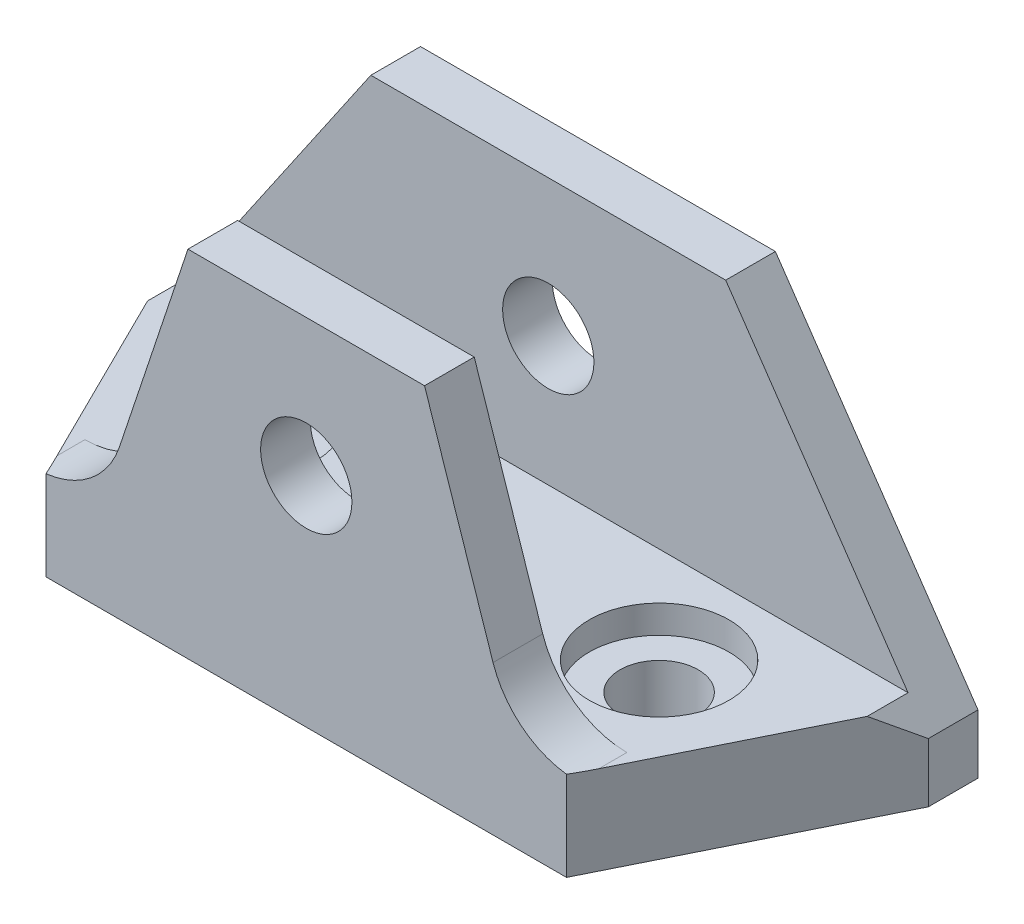
ISO-10303-21;
HEADER;
FILE_DESCRIPTION(('STEP AP214'),'2;1');
FILE_NAME('part.step','',(''),(''),'','','');
FILE_SCHEMA(('AUTOMOTIVE_DESIGN { 1 0 10303 214 1 1 1 1 }'));
ENDSEC;
DATA;
#1=APPLICATION_CONTEXT('core data for automotive mechanical design processes');
#2=APPLICATION_PROTOCOL_DEFINITION('international standard','automotive_design',2000,#1);
#3=PRODUCT_CONTEXT('',#1,'mechanical');
#4=PRODUCT('Part','Part','',(#3));
#5=PRODUCT_RELATED_PRODUCT_CATEGORY('part','',(#4));
#6=PRODUCT_DEFINITION_FORMATION('','',#4);
#7=PRODUCT_DEFINITION_CONTEXT('part definition',#1,'design');
#8=PRODUCT_DEFINITION('design','',#6,#7);
#9=PRODUCT_DEFINITION_SHAPE('','',#8);
#10=(LENGTH_UNIT() NAMED_UNIT(*) SI_UNIT(.MILLI.,.METRE.));
#11=(NAMED_UNIT(*) PLANE_ANGLE_UNIT() SI_UNIT($,.RADIAN.));
#12=(NAMED_UNIT(*) SI_UNIT($,.STERADIAN.) SOLID_ANGLE_UNIT());
#13=UNCERTAINTY_MEASURE_WITH_UNIT(LENGTH_MEASURE(1.E-05),#10,'distance_accuracy_value','');
#14=(GEOMETRIC_REPRESENTATION_CONTEXT(3) GLOBAL_UNCERTAINTY_ASSIGNED_CONTEXT((#13)) GLOBAL_UNIT_ASSIGNED_CONTEXT((#10,
#11,#12)) REPRESENTATION_CONTEXT('',''));
#15=CARTESIAN_POINT('',(0.,0.,0.));
#16=DIRECTION('',(0.,0.,1.));
#17=DIRECTION('',(1.,0.,0.));
#18=AXIS2_PLACEMENT_3D('',#15,#16,#17);
#19=CARTESIAN_POINT('',(0.,38.1,0.));
#20=DIRECTION('',(0.,1.,0.));
#21=DIRECTION('',(0.,0.,1.));
#22=AXIS2_PLACEMENT_3D('',#19,#20,#21);
#23=PLANE('',#22);
#24=DIRECTION('',(1.,0.,0.));
#25=VECTOR('',#24,1.);
#26=CARTESIAN_POINT('',(-78.9580948623392,38.0999999999999,15.6591));
#27=LINE('',#26,#25);
#28=CARTESIAN_POINT('',(-12.7,38.1,15.6591));
#29=VERTEX_POINT('',#28);
#30=CARTESIAN_POINT('',(12.7,38.1,15.6591));
#31=VERTEX_POINT('',#30);
#32=EDGE_CURVE('E270',#29,#31,#27,.T.);
#33=ORIENTED_EDGE('',*,*,#32,.T.);
#34=DIRECTION('',(0.,0.,-1.));
#35=VECTOR('',#34,1.);
#36=CARTESIAN_POINT('',(12.7,38.1,17.6921));
#37=LINE('',#36,#35);
#38=CARTESIAN_POINT('',(12.7,38.1,10.3251));
#39=VERTEX_POINT('',#38);
#40=EDGE_CURVE('E201',#31,#39,#37,.T.);
#41=ORIENTED_EDGE('',*,*,#40,.T.);
#42=DIRECTION('',(1.,0.,0.));
#43=VECTOR('',#42,1.);
#44=CARTESIAN_POINT('',(0.,38.1,10.3251));
#45=LINE('',#44,#43);
#46=CARTESIAN_POINT('',(-12.7,38.1,10.3251));
#47=VERTEX_POINT('',#46);
#48=EDGE_CURVE('E246',#47,#39,#45,.T.);
#49=ORIENTED_EDGE('',*,*,#48,.F.);
#50=DIRECTION('',(0.,0.,-1.));
#51=VECTOR('',#50,1.);
#52=CARTESIAN_POINT('',(-12.7,38.1,17.6921));
#53=LINE('',#52,#51);
#54=EDGE_CURVE('E200',#29,#47,#53,.T.);
#55=ORIENTED_EDGE('',*,*,#54,.F.);
#56=EDGE_LOOP('',(#33,#41,#49,#55));
#57=FACE_BOUND('',#56,.T.);
#58=ADVANCED_FACE('F46',(#57),#23,.T.);
#59=CARTESIAN_POINT('',(-26.9363714361226,38.1,17.6911));
#60=DIRECTION('',(0.896218075688714,0.,-0.443613751825637));
#61=DIRECTION('',(-0.443613751825637,0.,-0.896218075688714));
#62=AXIS2_PLACEMENT_3D('',#59,#60,#61);
#63=PLANE('',#62);
#64=DIRECTION('',(0.443613751825637,0.,0.896218075688714));
#65=VECTOR('',#64,1.);
#66=CARTESIAN_POINT('',(-26.9363714361226,0.,17.6911));
#67=LINE('',#66,#65);
#68=CARTESIAN_POINT('',(-40.8039466737082,0.,-10.3251));
#69=VERTEX_POINT('',#68);
#70=CARTESIAN_POINT('',(-27.9421792502721,-1.19709658412708E-13,15.6591));
#71=VERTEX_POINT('',#70);
#72=EDGE_CURVE('E184',#69,#71,#67,.T.);
#73=ORIENTED_EDGE('',*,*,#72,.T.);
#74=DIRECTION('',(0.,1.,0.));
#75=VECTOR('',#74,1.);
#76=CARTESIAN_POINT('',(-27.9421792502721,38.1,15.6591));
#77=LINE('',#76,#75);
#78=CARTESIAN_POINT('',(-27.9421792502721,9.59444074267461,15.6591));
#79=VERTEX_POINT('',#78);
#80=EDGE_CURVE('E294',#71,#79,#77,.T.);
#81=ORIENTED_EDGE('',*,*,#80,.T.);
#82=CARTESIAN_POINT('',(-29.0902315710346,19.05,13.3397281647731));
#83=DIRECTION('',(0.896218075688714,0.,-0.443613751825637));
#84=DIRECTION('',(-0.443613751825637,0.,-0.896218075688714));
#85=AXIS2_PLACEMENT_3D('',#82,#83,#84);
#86=ELLIPSE('',#85,21.4713812653486,9.525);
#87=CARTESIAN_POINT('',(-29.0902315710346,9.525,13.3397281647731));
#88=VERTEX_POINT('',#87);
#89=EDGE_CURVE('E264',#79,#88,#86,.T.);
#90=ORIENTED_EDGE('',*,*,#89,.T.);
#91=DIRECTION('',(0.443613751825637,0.,0.896218075688714));
#92=VECTOR('',#91,1.);
#93=CARTESIAN_POINT('',(-26.9363714361226,9.525,17.6911));
#94=LINE('',#93,#92);
#95=CARTESIAN_POINT('',(-38.6285520063374,9.525,-5.93022266666416));
#96=VERTEX_POINT('',#95);
#97=EDGE_CURVE('E237',#96,#88,#94,.T.);
#98=ORIENTED_EDGE('',*,*,#97,.F.);
#99=DIRECTION('',(0.372377292082729,0.543486623414217,0.752301430618703));
#100=VECTOR('',#99,1.);
#101=CARTESIAN_POINT('',(-28.5822622587059,24.1876129167084,14.3659616341608));
#102=LINE('',#101,#100);
#103=CARTESIAN_POINT('',(-40.8039466737082,6.35,-10.3251));
#104=VERTEX_POINT('',#103);
#105=EDGE_CURVE('E325',#104,#96,#102,.T.);
#106=ORIENTED_EDGE('',*,*,#105,.F.);
#107=DIRECTION('',(0.,1.,0.));
#108=VECTOR('',#107,1.);
#109=CARTESIAN_POINT('',(-40.8039466737082,0.,-10.3251));
#110=LINE('',#109,#108);
#111=EDGE_CURVE('E307',#69,#104,#110,.T.);
#112=ORIENTED_EDGE('',*,*,#111,.F.);
#113=EDGE_LOOP('',(#73,#81,#90,#98,#106,#112));
#114=FACE_BOUND('',#113,.T.);
#115=ADVANCED_FACE('F369',(#114),#63,.F.);
#116=CARTESIAN_POINT('',(44.45,38.1,-17.6911));
#117=DIRECTION('',(-0.896218075688714,0.,-0.443613751825637));
#118=DIRECTION('',(-0.443613751825637,0.,0.896218075688714));
#119=AXIS2_PLACEMENT_3D('',#116,#117,#118);
#120=PLANE('',#119);
#121=CARTESIAN_POINT('',(29.0902315710346,19.05,13.3397281647731));
#122=DIRECTION('',(-0.896218075688714,0.,-0.443613751825637));
#123=DIRECTION('',(0.443613751825637,0.,-0.896218075688714));
#124=AXIS2_PLACEMENT_3D('',#121,#122,#123);
#125=ELLIPSE('',#124,21.4713812653486,9.525);
#126=CARTESIAN_POINT('',(29.0902315710346,9.525,13.3397281647731));
#127=VERTEX_POINT('',#126);
#128=CARTESIAN_POINT('',(27.9421792502721,9.59444074267461,15.6591));
#129=VERTEX_POINT('',#128);
#130=EDGE_CURVE('E12',#127,#129,#125,.T.);
#131=ORIENTED_EDGE('',*,*,#130,.T.);
#132=DIRECTION('',(0.,-1.,0.));
#133=VECTOR('',#132,1.);
#134=CARTESIAN_POINT('',(27.9421792502721,38.1,15.6591));
#135=LINE('',#134,#133);
#136=CARTESIAN_POINT('',(27.9421792502721,0.,15.6591));
#137=VERTEX_POINT('',#136);
#138=EDGE_CURVE('E63',#129,#137,#135,.T.);
#139=ORIENTED_EDGE('',*,*,#138,.T.);
#140=DIRECTION('',(0.443613751825637,0.,-0.896218075688714));
#141=VECTOR('',#140,1.);
#142=CARTESIAN_POINT('',(44.45,0.,-17.6911));
#143=LINE('',#142,#141);
#144=CARTESIAN_POINT('',(40.8039466737082,0.,-10.3251));
#145=VERTEX_POINT('',#144);
#146=EDGE_CURVE('E241',#137,#145,#143,.T.);
#147=ORIENTED_EDGE('',*,*,#146,.T.);
#148=DIRECTION('',(0.,-1.,0.));
#149=VECTOR('',#148,1.);
#150=CARTESIAN_POINT('',(40.8039466737082,-1.064395312124E-13,-10.3251));
#151=LINE('',#150,#149);
#152=CARTESIAN_POINT('',(40.8039466737082,6.35,-10.3251));
#153=VERTEX_POINT('',#152);
#154=EDGE_CURVE('E309',#153,#145,#151,.T.);
#155=ORIENTED_EDGE('',*,*,#154,.F.);
#156=DIRECTION('',(0.372377292082728,-0.543486623414217,-0.752301430618703));
#157=VECTOR('',#156,1.);
#158=CARTESIAN_POINT('',(28.582262258706,24.1876129167083,14.3659616341608));
#159=LINE('',#158,#157);
#160=CARTESIAN_POINT('',(38.6285520063374,9.525,-5.93022266666406));
#161=VERTEX_POINT('',#160);
#162=EDGE_CURVE('E196',#161,#153,#159,.T.);
#163=ORIENTED_EDGE('',*,*,#162,.F.);
#164=DIRECTION('',(0.443613751825637,0.,-0.896218075688714));
#165=VECTOR('',#164,1.);
#166=CARTESIAN_POINT('',(44.45,9.525,-17.6911));
#167=LINE('',#166,#165);
#168=EDGE_CURVE('E249',#127,#161,#167,.T.);
#169=ORIENTED_EDGE('',*,*,#168,.F.);
#170=EDGE_LOOP('',(#131,#139,#147,#155,#163,#169));
#171=FACE_BOUND('',#170,.T.);
#172=ADVANCED_FACE('F347',(#171),#120,.F.);
#173=DIRECTION('',(1.,0.,0.));
#174=VECTOR('',#173,1.);
#175=CARTESIAN_POINT('',(-78.9580948623392,38.0999999999999,-15.6591));
#176=LINE('',#175,#174);
#177=CARTESIAN_POINT('',(-19.05,38.1,-15.6591));
#178=VERTEX_POINT('',#177);
#179=CARTESIAN_POINT('',(19.05,38.1,-15.6591));
#180=VERTEX_POINT('',#179);
#181=EDGE_CURVE('E71',#178,#180,#176,.T.);
#182=ORIENTED_EDGE('',*,*,#181,.F.);
#183=DIRECTION('',(0.,0.,-1.));
#184=VECTOR('',#183,1.);
#185=CARTESIAN_POINT('',(-19.05,38.1,17.6921));
#186=LINE('',#185,#184);
#187=CARTESIAN_POINT('',(-19.05,38.1,-10.3251));
#188=VERTEX_POINT('',#187);
#189=EDGE_CURVE('E185',#188,#178,#186,.T.);
#190=ORIENTED_EDGE('',*,*,#189,.F.);
#191=DIRECTION('',(-1.,0.,0.));
#192=VECTOR('',#191,1.);
#193=CARTESIAN_POINT('',(0.,38.1,-10.3251));
#194=LINE('',#193,#192);
#195=CARTESIAN_POINT('',(19.05,38.1,-10.3251));
#196=VERTEX_POINT('',#195);
#197=EDGE_CURVE('E243',#196,#188,#194,.T.);
#198=ORIENTED_EDGE('',*,*,#197,.F.);
#199=DIRECTION('',(0.,0.,-1.));
#200=VECTOR('',#199,1.);
#201=CARTESIAN_POINT('',(19.05,38.1,17.6921));
#202=LINE('',#201,#200);
#203=EDGE_CURVE('E316',#196,#180,#202,.T.);
#204=ORIENTED_EDGE('',*,*,#203,.T.);
#205=EDGE_LOOP('',(#182,#190,#198,#204));
#206=FACE_BOUND('',#205,.T.);
#207=ADVANCED_FACE('F334',(#206),#23,.T.);
#208=CARTESIAN_POINT('',(0.,0.,0.));
#209=DIRECTION('',(0.,1.,0.));
#210=DIRECTION('',(0.,0.,1.));
#211=AXIS2_PLACEMENT_3D('',#208,#209,#210);
#212=PLANE('',#211);
#213=CARTESIAN_POINT('',(-22.225,0.,0.));
#214=DIRECTION('',(0.,1.,0.));
#215=DIRECTION('',(0.,0.,1.));
#216=AXIS2_PLACEMENT_3D('',#213,#214,#215);
#217=CIRCLE('',#216,4.2);
#218=CARTESIAN_POINT('',(-22.225,0.,4.2));
#219=VERTEX_POINT('',#218);
#220=EDGE_CURVE('E217',#219,#219,#217,.T.);
#221=ORIENTED_EDGE('',*,*,#220,.T.);
#222=EDGE_LOOP('',(#221));
#223=FACE_BOUND('',#222,.T.);
#224=CARTESIAN_POINT('',(22.225,0.,0.));
#225=DIRECTION('',(0.,1.,0.));
#226=DIRECTION('',(0.,0.,1.));
#227=AXIS2_PLACEMENT_3D('',#224,#225,#226);
#228=CIRCLE('',#227,4.2);
#229=CARTESIAN_POINT('',(22.225,0.,4.2));
#230=VERTEX_POINT('',#229);
#231=EDGE_CURVE('E229',#230,#230,#228,.T.);
#232=ORIENTED_EDGE('',*,*,#231,.T.);
#233=EDGE_LOOP('',(#232));
#234=FACE_BOUND('',#233,.T.);
#235=ORIENTED_EDGE('',*,*,#146,.F.);
#236=DIRECTION('',(1.,0.,0.));
#237=VECTOR('',#236,1.);
#238=CARTESIAN_POINT('',(-78.9580948623392,-1.75456749096616E-13,15.6591));
#239=LINE('',#238,#237);
#240=EDGE_CURVE('E276',#71,#137,#239,.T.);
#241=ORIENTED_EDGE('',*,*,#240,.F.);
#242=ORIENTED_EDGE('',*,*,#72,.F.);
#243=DIRECTION('',(0.,0.,-1.));
#244=VECTOR('',#243,1.);
#245=CARTESIAN_POINT('',(-40.8039466737082,0.,17.6921));
#246=LINE('',#245,#244);
#247=CARTESIAN_POINT('',(-40.8039466737082,-1.75705597326203E-13,-15.6591));
#248=VERTEX_POINT('',#247);
#249=EDGE_CURVE('E174',#69,#248,#246,.T.);
#250=ORIENTED_EDGE('',*,*,#249,.T.);
#251=DIRECTION('',(1.,0.,0.));
#252=VECTOR('',#251,1.);
#253=CARTESIAN_POINT('',(-78.9580948623392,-1.75705597326203E-13,-15.6591));
#254=LINE('',#253,#252);
#255=CARTESIAN_POINT('',(40.8039466737082,0.,-15.6591));
#256=VERTEX_POINT('',#255);
#257=EDGE_CURVE('E159',#248,#256,#254,.T.);
#258=ORIENTED_EDGE('',*,*,#257,.T.);
#259=DIRECTION('',(0.,0.,-1.));
#260=VECTOR('',#259,1.);
#261=CARTESIAN_POINT('',(40.8039466737082,0.,17.6921));
#262=LINE('',#261,#260);
#263=EDGE_CURVE('E313',#145,#256,#262,.T.);
#264=ORIENTED_EDGE('',*,*,#263,.F.);
#265=EDGE_LOOP('',(#235,#241,#242,#250,#258,#264));
#266=FACE_BOUND('',#265,.T.);
#267=ADVANCED_FACE('F181',(#223,#234,#266),#212,.F.);
#268=CARTESIAN_POINT('',(0.,9.525,0.));
#269=DIRECTION('',(0.,1.,0.));
#270=DIRECTION('',(0.,0.,1.));
#271=AXIS2_PLACEMENT_3D('',#268,#269,#270);
#272=PLANE('',#271);
#273=DIRECTION('',(0.,0.,-1.));
#274=VECTOR('',#273,1.);
#275=CARTESIAN_POINT('',(38.6285520063374,9.525,17.6921));
#276=LINE('',#275,#274);
#277=CARTESIAN_POINT('',(38.6285520063374,9.52500000000001,-10.3251));
#278=VERTEX_POINT('',#277);
#279=EDGE_CURVE('E207',#161,#278,#276,.T.);
#280=ORIENTED_EDGE('',*,*,#279,.T.);
#281=DIRECTION('',(1.,0.,0.));
#282=VECTOR('',#281,1.);
#283=CARTESIAN_POINT('',(-44.45,9.52500000000001,-10.3251));
#284=LINE('',#283,#282);
#285=CARTESIAN_POINT('',(-38.6285520063374,9.52500000000001,-10.3251));
#286=VERTEX_POINT('',#285);
#287=EDGE_CURVE('E234',#286,#278,#284,.T.);
#288=ORIENTED_EDGE('',*,*,#287,.F.);
#289=DIRECTION('',(0.,0.,1.));
#290=VECTOR('',#289,1.);
#291=CARTESIAN_POINT('',(-38.6285520063374,9.525,17.6921));
#292=LINE('',#291,#290);
#293=EDGE_CURVE('E188',#286,#96,#292,.T.);
#294=ORIENTED_EDGE('',*,*,#293,.T.);
#295=ORIENTED_EDGE('',*,*,#97,.T.);
#296=DIRECTION('',(0.,0.,-1.));
#297=VECTOR('',#296,1.);
#298=CARTESIAN_POINT('',(-29.0902315710346,9.525,0.));
#299=LINE('',#298,#297);
#300=CARTESIAN_POINT('',(-29.0902315710346,9.52500000000001,10.3251));
#301=VERTEX_POINT('',#300);
#302=EDGE_CURVE('E254',#88,#301,#299,.T.);
#303=ORIENTED_EDGE('',*,*,#302,.T.);
#304=DIRECTION('',(-1.,0.,0.));
#305=VECTOR('',#304,1.);
#306=CARTESIAN_POINT('',(-44.45,9.52500000000001,10.3251));
#307=LINE('',#306,#305);
#308=CARTESIAN_POINT('',(29.0902315710346,9.525,10.3251));
#309=VERTEX_POINT('',#308);
#310=EDGE_CURVE('E232',#309,#301,#307,.T.);
#311=ORIENTED_EDGE('',*,*,#310,.F.);
#312=DIRECTION('',(0.,0.,-1.));
#313=VECTOR('',#312,1.);
#314=CARTESIAN_POINT('',(29.0902315710346,9.525,0.));
#315=LINE('',#314,#313);
#316=EDGE_CURVE('E252',#309,#127,#315,.F.);
#317=ORIENTED_EDGE('',*,*,#316,.T.);
#318=ORIENTED_EDGE('',*,*,#168,.T.);
#319=EDGE_LOOP('',(#280,#288,#294,#295,#303,#311,#317,#318));
#320=FACE_BOUND('',#319,.T.);
#321=CARTESIAN_POINT('',(-22.225,9.525,0.));
#322=DIRECTION('',(0.,1.,0.));
#323=DIRECTION('',(0.,0.,1.));
#324=AXIS2_PLACEMENT_3D('',#321,#322,#323);
#325=CIRCLE('',#324,7.5);
#326=CARTESIAN_POINT('',(-22.225,9.525,7.5));
#327=VERTEX_POINT('',#326);
#328=EDGE_CURVE('E203',#327,#327,#325,.T.);
#329=ORIENTED_EDGE('',*,*,#328,.F.);
#330=EDGE_LOOP('',(#329));
#331=FACE_BOUND('',#330,.T.);
#332=CARTESIAN_POINT('',(22.225,9.525,0.));
#333=DIRECTION('',(0.,1.,0.));
#334=DIRECTION('',(0.,0.,1.));
#335=AXIS2_PLACEMENT_3D('',#332,#333,#334);
#336=CIRCLE('',#335,7.5);
#337=CARTESIAN_POINT('',(22.225,9.525,7.5));
#338=VERTEX_POINT('',#337);
#339=EDGE_CURVE('E220',#338,#338,#336,.T.);
#340=ORIENTED_EDGE('',*,*,#339,.F.);
#341=EDGE_LOOP('',(#340));
#342=FACE_BOUND('',#341,.T.);
#343=ADVANCED_FACE('F341',(#320,#331,#342),#272,.T.);
#344=CARTESIAN_POINT('',(-44.45,-91.266865619676,10.3251));
#345=DIRECTION('',(0.,0.,1.));
#346=DIRECTION('',(1.,0.,0.));
#347=AXIS2_PLACEMENT_3D('',#344,#345,#346);
#348=PLANE('',#347);
#349=CARTESIAN_POINT('',(0.,23.392384,10.3251));
#350=DIRECTION('',(0.,0.,1.));
#351=DIRECTION('',(1.,0.,0.));
#352=AXIS2_PLACEMENT_3D('',#349,#350,#351);
#353=CIRCLE('',#352,4.90219999999999);
#354=CARTESIAN_POINT('',(4.90219999999999,23.392384,10.3251));
#355=VERTEX_POINT('',#354);
#356=EDGE_CURVE('E304',#355,#355,#353,.T.);
#357=ORIENTED_EDGE('',*,*,#356,.T.);
#358=EDGE_LOOP('',(#357));
#359=FACE_BOUND('',#358,.T.);
#360=ORIENTED_EDGE('',*,*,#310,.T.);
#361=CARTESIAN_POINT('',(-29.0902315710346,19.05,10.3251));
#362=DIRECTION('',(0.,0.,1.));
#363=DIRECTION('',(1.,0.,0.));
#364=AXIS2_PLACEMENT_3D('',#361,#362,#363);
#365=CIRCLE('',#364,9.525);
#366=CARTESIAN_POINT('',(-20.0540231571035,16.0379305286896,10.3251));
#367=VERTEX_POINT('',#366);
#368=EDGE_CURVE('E262',#301,#367,#365,.T.);
#369=ORIENTED_EDGE('',*,*,#368,.T.);
#370=DIRECTION('',(-0.316227766016838,-0.948683298050514,0.));
#371=VECTOR('',#370,1.);
#372=CARTESIAN_POINT('',(-22.86,7.62000000000001,10.3251));
#373=LINE('',#372,#371);
#374=EDGE_CURVE('E197',#47,#367,#373,.T.);
#375=ORIENTED_EDGE('',*,*,#374,.F.);
#376=ORIENTED_EDGE('',*,*,#48,.T.);
#377=DIRECTION('',(-0.316227766016838,0.948683298050514,0.));
#378=VECTOR('',#377,1.);
#379=CARTESIAN_POINT('',(22.86,7.61999999999999,10.3251));
#380=LINE('',#379,#378);
#381=CARTESIAN_POINT('',(20.0540231571035,16.0379305286896,10.3251));
#382=VERTEX_POINT('',#381);
#383=EDGE_CURVE('E204',#382,#39,#380,.T.);
#384=ORIENTED_EDGE('',*,*,#383,.F.);
#385=CARTESIAN_POINT('',(29.0902315710346,19.05,10.3251));
#386=DIRECTION('',(0.,0.,1.));
#387=DIRECTION('',(1.,0.,0.));
#388=AXIS2_PLACEMENT_3D('',#385,#386,#387);
#389=CIRCLE('',#388,9.525);
#390=EDGE_CURVE('E55',#382,#309,#389,.T.);
#391=ORIENTED_EDGE('',*,*,#390,.T.);
#392=EDGE_LOOP('',(#360,#369,#375,#376,#384,#391));
#393=FACE_BOUND('',#392,.T.);
#394=ADVANCED_FACE('F359',(#359,#393),#348,.F.);
#395=CARTESIAN_POINT('',(-44.45,-91.266865619676,-10.3251));
#396=DIRECTION('',(0.,0.,-1.));
#397=DIRECTION('',(-1.,0.,0.));
#398=AXIS2_PLACEMENT_3D('',#395,#396,#397);
#399=PLANE('',#398);
#400=CARTESIAN_POINT('',(0.,23.392384,-10.3251));
#401=DIRECTION('',(0.,0.,-1.));
#402=DIRECTION('',(-1.,0.,0.));
#403=AXIS2_PLACEMENT_3D('',#400,#401,#402);
#404=CIRCLE('',#403,4.90219999999999);
#405=CARTESIAN_POINT('',(-4.90219999999999,23.392384,-10.3251));
#406=VERTEX_POINT('',#405);
#407=EDGE_CURVE('E301',#406,#406,#404,.T.);
#408=ORIENTED_EDGE('',*,*,#407,.T.);
#409=EDGE_LOOP('',(#408));
#410=FACE_BOUND('',#409,.T.);
#411=ORIENTED_EDGE('',*,*,#287,.T.);
#412=DIRECTION('',(0.565219364643958,-0.824940646247644,0.));
#413=VECTOR('',#412,1.);
#414=CARTESIAN_POINT('',(30.7290201848444,21.054408391698,-10.3251));
#415=LINE('',#414,#413);
#416=EDGE_CURVE('E315',#196,#278,#415,.T.);
#417=ORIENTED_EDGE('',*,*,#416,.F.);
#418=ORIENTED_EDGE('',*,*,#197,.T.);
#419=DIRECTION('',(0.565219364643958,0.824940646247644,0.));
#420=VECTOR('',#419,1.);
#421=CARTESIAN_POINT('',(-30.7290201848444,21.054408391698,-10.3251));
#422=LINE('',#421,#420);
#423=EDGE_CURVE('E190',#286,#188,#422,.T.);
#424=ORIENTED_EDGE('',*,*,#423,.F.);
#425=EDGE_LOOP('',(#411,#417,#418,#424));
#426=FACE_BOUND('',#425,.T.);
#427=ADVANCED_FACE('F336',(#410,#426),#399,.F.);
#428=CARTESIAN_POINT('',(22.225,9.525,0.));
#429=DIRECTION('',(0.,1.,0.));
#430=DIRECTION('',(0.,0.,1.));
#431=AXIS2_PLACEMENT_3D('',#428,#429,#430);
#432=CYLINDRICAL_SURFACE('',#431,4.2);
#433=ORIENTED_EDGE('',*,*,#231,.F.);
#434=EDGE_LOOP('',(#433));
#435=FACE_BOUND('',#434,.T.);
#436=CARTESIAN_POINT('',(22.225,6.525,0.));
#437=DIRECTION('',(0.,1.,0.));
#438=DIRECTION('',(0.,0.,1.));
#439=AXIS2_PLACEMENT_3D('',#436,#437,#438);
#440=CIRCLE('',#439,4.2);
#441=CARTESIAN_POINT('',(22.225,6.525,4.2));
#442=VERTEX_POINT('',#441);
#443=EDGE_CURVE('E226',#442,#442,#440,.T.);
#444=ORIENTED_EDGE('',*,*,#443,.T.);
#445=EDGE_LOOP('',(#444));
#446=FACE_BOUND('',#445,.T.);
#447=ADVANCED_FACE('F413',(#435,#446),#432,.F.);
#448=CARTESIAN_POINT('',(26.425,6.525,0.));
#449=DIRECTION('',(0.,-1.,0.));
#450=DIRECTION('',(0.,0.,-1.));
#451=AXIS2_PLACEMENT_3D('',#448,#449,#450);
#452=PLANE('',#451);
#453=ORIENTED_EDGE('',*,*,#443,.F.);
#454=EDGE_LOOP('',(#453));
#455=FACE_BOUND('',#454,.T.);
#456=CARTESIAN_POINT('',(22.225,6.525,0.));
#457=DIRECTION('',(0.,1.,0.));
#458=DIRECTION('',(0.,0.,1.));
#459=AXIS2_PLACEMENT_3D('',#456,#457,#458);
#460=CIRCLE('',#459,7.5);
#461=CARTESIAN_POINT('',(22.225,6.525,7.5));
#462=VERTEX_POINT('',#461);
#463=EDGE_CURVE('E223',#462,#462,#460,.T.);
#464=ORIENTED_EDGE('',*,*,#463,.T.);
#465=EDGE_LOOP('',(#464));
#466=FACE_BOUND('',#465,.T.);
#467=ADVANCED_FACE('F409',(#455,#466),#452,.F.);
#468=CARTESIAN_POINT('',(22.225,9.525,0.));
#469=DIRECTION('',(0.,1.,0.));
#470=DIRECTION('',(0.,0.,1.));
#471=AXIS2_PLACEMENT_3D('',#468,#469,#470);
#472=CYLINDRICAL_SURFACE('',#471,7.5);
#473=ORIENTED_EDGE('',*,*,#463,.F.);
#474=EDGE_LOOP('',(#473));
#475=FACE_BOUND('',#474,.T.);
#476=ORIENTED_EDGE('',*,*,#339,.T.);
#477=EDGE_LOOP('',(#476));
#478=FACE_BOUND('',#477,.T.);
#479=ADVANCED_FACE('F405',(#475,#478),#472,.F.);
#480=CARTESIAN_POINT('',(-22.225,9.525,0.));
#481=DIRECTION('',(0.,1.,0.));
#482=DIRECTION('',(0.,0.,1.));
#483=AXIS2_PLACEMENT_3D('',#480,#481,#482);
#484=CYLINDRICAL_SURFACE('',#483,4.2);
#485=ORIENTED_EDGE('',*,*,#220,.F.);
#486=EDGE_LOOP('',(#485));
#487=FACE_BOUND('',#486,.T.);
#488=CARTESIAN_POINT('',(-22.225,6.525,0.));
#489=DIRECTION('',(0.,1.,0.));
#490=DIRECTION('',(0.,0.,1.));
#491=AXIS2_PLACEMENT_3D('',#488,#489,#490);
#492=CIRCLE('',#491,4.2);
#493=CARTESIAN_POINT('',(-22.225,6.525,4.2));
#494=VERTEX_POINT('',#493);
#495=EDGE_CURVE('E214',#494,#494,#492,.T.);
#496=ORIENTED_EDGE('',*,*,#495,.T.);
#497=EDGE_LOOP('',(#496));
#498=FACE_BOUND('',#497,.T.);
#499=ADVANCED_FACE('F401',(#487,#498),#484,.F.);
#500=CARTESIAN_POINT('',(-18.025,6.525,0.));
#501=DIRECTION('',(0.,-1.,0.));
#502=DIRECTION('',(0.,0.,-1.));
#503=AXIS2_PLACEMENT_3D('',#500,#501,#502);
#504=PLANE('',#503);
#505=ORIENTED_EDGE('',*,*,#495,.F.);
#506=EDGE_LOOP('',(#505));
#507=FACE_BOUND('',#506,.T.);
#508=CARTESIAN_POINT('',(-22.225,6.525,0.));
#509=DIRECTION('',(0.,1.,0.));
#510=DIRECTION('',(0.,0.,1.));
#511=AXIS2_PLACEMENT_3D('',#508,#509,#510);
#512=CIRCLE('',#511,7.5);
#513=CARTESIAN_POINT('',(-22.225,6.525,7.5));
#514=VERTEX_POINT('',#513);
#515=EDGE_CURVE('E211',#514,#514,#512,.T.);
#516=ORIENTED_EDGE('',*,*,#515,.T.);
#517=EDGE_LOOP('',(#516));
#518=FACE_BOUND('',#517,.T.);
#519=ADVANCED_FACE('F397',(#507,#518),#504,.F.);
#520=CARTESIAN_POINT('',(-22.225,9.525,0.));
#521=DIRECTION('',(0.,1.,0.));
#522=DIRECTION('',(0.,0.,1.));
#523=AXIS2_PLACEMENT_3D('',#520,#521,#522);
#524=CYLINDRICAL_SURFACE('',#523,7.5);
#525=ORIENTED_EDGE('',*,*,#515,.F.);
#526=EDGE_LOOP('',(#525));
#527=FACE_BOUND('',#526,.T.);
#528=ORIENTED_EDGE('',*,*,#328,.T.);
#529=EDGE_LOOP('',(#528));
#530=FACE_BOUND('',#529,.T.);
#531=ADVANCED_FACE('F390',(#527,#530),#524,.F.);
#532=CARTESIAN_POINT('',(22.86,7.61999999999999,17.6921));
#533=DIRECTION('',(-0.948683298050514,-0.316227766016838,0.));
#534=DIRECTION('',(0.316227766016838,-0.948683298050514,0.));
#535=AXIS2_PLACEMENT_3D('',#532,#533,#534);
#536=PLANE('',#535);
#537=ORIENTED_EDGE('',*,*,#40,.F.);
#538=DIRECTION('',(0.316227766016838,-0.948683298050514,0.));
#539=VECTOR('',#538,1.);
#540=CARTESIAN_POINT('',(22.86,7.61999999999999,15.6591));
#541=LINE('',#540,#539);
#542=CARTESIAN_POINT('',(20.0540231571035,16.0379305286896,15.6591));
#543=VERTEX_POINT('',#542);
#544=EDGE_CURVE('E273',#31,#543,#541,.T.);
#545=ORIENTED_EDGE('',*,*,#544,.T.);
#546=DIRECTION('',(0.,0.,-1.));
#547=VECTOR('',#546,1.);
#548=CARTESIAN_POINT('',(20.0540231571035,16.0379305286896,17.6921));
#549=LINE('',#548,#547);
#550=EDGE_CURVE('E260',#543,#382,#549,.T.);
#551=ORIENTED_EDGE('',*,*,#550,.T.);
#552=ORIENTED_EDGE('',*,*,#383,.T.);
#553=EDGE_LOOP('',(#537,#545,#551,#552));
#554=FACE_BOUND('',#553,.T.);
#555=ADVANCED_FACE('F354',(#554),#536,.F.);
#556=CARTESIAN_POINT('',(-22.86,7.62000000000001,17.6921));
#557=DIRECTION('',(0.948683298050514,-0.316227766016838,0.));
#558=DIRECTION('',(0.316227766016838,0.948683298050514,0.));
#559=AXIS2_PLACEMENT_3D('',#556,#557,#558);
#560=PLANE('',#559);
#561=DIRECTION('',(0.,0.,-1.));
#562=VECTOR('',#561,1.);
#563=CARTESIAN_POINT('',(-20.0540231571035,16.0379305286896,17.6921));
#564=LINE('',#563,#562);
#565=CARTESIAN_POINT('',(-20.0540231571035,16.0379305286896,15.6591));
#566=VERTEX_POINT('',#565);
#567=EDGE_CURVE('E257',#367,#566,#564,.F.);
#568=ORIENTED_EDGE('',*,*,#567,.T.);
#569=DIRECTION('',(0.316227766016838,0.948683298050514,0.));
#570=VECTOR('',#569,1.);
#571=CARTESIAN_POINT('',(-22.86,7.62000000000001,15.6591));
#572=LINE('',#571,#570);
#573=EDGE_CURVE('E291',#566,#29,#572,.T.);
#574=ORIENTED_EDGE('',*,*,#573,.T.);
#575=ORIENTED_EDGE('',*,*,#54,.T.);
#576=ORIENTED_EDGE('',*,*,#374,.T.);
#577=EDGE_LOOP('',(#568,#574,#575,#576));
#578=FACE_BOUND('',#577,.T.);
#579=ADVANCED_FACE('F363',(#578),#560,.F.);
#580=CARTESIAN_POINT('',(-29.0902315710346,19.05,0.));
#581=DIRECTION('',(0.,0.,-1.));
#582=DIRECTION('',(-1.,0.,0.));
#583=AXIS2_PLACEMENT_3D('',#580,#581,#582);
#584=CYLINDRICAL_SURFACE('',#583,9.525);
#585=ORIENTED_EDGE('',*,*,#89,.F.);
#586=CARTESIAN_POINT('',(-29.0902315710346,19.05,15.6591));
#587=DIRECTION('',(0.,0.,-1.));
#588=DIRECTION('',(-1.,0.,0.));
#589=AXIS2_PLACEMENT_3D('',#586,#587,#588);
#590=CIRCLE('',#589,9.525);
#591=EDGE_CURVE('E288',#79,#566,#590,.F.);
#592=ORIENTED_EDGE('',*,*,#591,.T.);
#593=ORIENTED_EDGE('',*,*,#567,.F.);
#594=ORIENTED_EDGE('',*,*,#368,.F.);
#595=ORIENTED_EDGE('',*,*,#302,.F.);
#596=EDGE_LOOP('',(#585,#592,#593,#594,#595));
#597=FACE_BOUND('',#596,.T.);
#598=ADVANCED_FACE('F366',(#597),#584,.F.);
#599=CARTESIAN_POINT('',(29.0902315710346,19.05,17.6921));
#600=DIRECTION('',(0.,0.,-1.));
#601=DIRECTION('',(-1.,0.,0.));
#602=AXIS2_PLACEMENT_3D('',#599,#600,#601);
#603=CYLINDRICAL_SURFACE('',#602,9.525);
#604=ORIENTED_EDGE('',*,*,#550,.F.);
#605=CARTESIAN_POINT('',(29.0902315710346,19.05,15.6591));
#606=DIRECTION('',(0.,0.,-1.));
#607=DIRECTION('',(-1.,0.,0.));
#608=AXIS2_PLACEMENT_3D('',#605,#606,#607);
#609=CIRCLE('',#608,9.525);
#610=EDGE_CURVE('E269',#543,#129,#609,.F.);
#611=ORIENTED_EDGE('',*,*,#610,.T.);
#612=ORIENTED_EDGE('',*,*,#130,.F.);
#613=ORIENTED_EDGE('',*,*,#316,.F.);
#614=ORIENTED_EDGE('',*,*,#390,.F.);
#615=EDGE_LOOP('',(#604,#611,#612,#613,#614));
#616=FACE_BOUND('',#615,.T.);
#617=ADVANCED_FACE('F48',(#616),#603,.F.);
#618=CARTESIAN_POINT('',(-30.7290201848444,21.054408391698,17.6921));
#619=DIRECTION('',(0.824940646247644,-0.565219364643958,0.));
#620=DIRECTION('',(0.565219364643958,0.824940646247644,0.));
#621=AXIS2_PLACEMENT_3D('',#618,#619,#620);
#622=PLANE('',#621);
#623=ORIENTED_EDGE('',*,*,#189,.T.);
#624=DIRECTION('',(-0.565219364643958,-0.824940646247644,0.));
#625=VECTOR('',#624,1.);
#626=CARTESIAN_POINT('',(-30.7290201848444,21.054408391698,-15.6591));
#627=LINE('',#626,#625);
#628=CARTESIAN_POINT('',(-40.8039466737082,6.35,-15.6591));
#629=VERTEX_POINT('',#628);
#630=EDGE_CURVE('E299',#178,#629,#627,.T.);
#631=ORIENTED_EDGE('',*,*,#630,.T.);
#632=DIRECTION('',(0.,0.,-1.));
#633=VECTOR('',#632,1.);
#634=CARTESIAN_POINT('',(-40.8039466737082,6.35,17.6921));
#635=LINE('',#634,#633);
#636=EDGE_CURVE('E177',#104,#629,#635,.T.);
#637=ORIENTED_EDGE('',*,*,#636,.F.);
#638=ORIENTED_EDGE('',*,*,#105,.T.);
#639=ORIENTED_EDGE('',*,*,#293,.F.);
#640=ORIENTED_EDGE('',*,*,#423,.T.);
#641=EDGE_LOOP('',(#623,#631,#637,#638,#639,#640));
#642=FACE_BOUND('',#641,.T.);
#643=ADVANCED_FACE('F329',(#642),#622,.F.);
#644=CARTESIAN_POINT('',(-40.8039466737082,0.,17.6921));
#645=DIRECTION('',(1.,0.,0.));
#646=DIRECTION('',(0.,0.,-1.));
#647=AXIS2_PLACEMENT_3D('',#644,#645,#646);
#648=PLANE('',#647);
#649=ORIENTED_EDGE('',*,*,#636,.T.);
#650=DIRECTION('',(0.,1.,0.));
#651=VECTOR('',#650,1.);
#652=CARTESIAN_POINT('',(-40.8039466737082,-1.75705597326203E-13,-15.6591));
#653=LINE('',#652,#651);
#654=EDGE_CURVE('E162',#248,#629,#653,.T.);
#655=ORIENTED_EDGE('',*,*,#654,.F.);
#656=ORIENTED_EDGE('',*,*,#249,.F.);
#657=ORIENTED_EDGE('',*,*,#111,.T.);
#658=EDGE_LOOP('',(#649,#655,#656,#657));
#659=FACE_BOUND('',#658,.T.);
#660=ADVANCED_FACE('F173',(#659),#648,.F.);
#661=CARTESIAN_POINT('',(40.8039466737082,0.,17.6921));
#662=DIRECTION('',(-1.,0.,0.));
#663=DIRECTION('',(0.,-1.,0.));
#664=AXIS2_PLACEMENT_3D('',#661,#662,#663);
#665=PLANE('',#664);
#666=ORIENTED_EDGE('',*,*,#263,.T.);
#667=DIRECTION('',(0.,-1.,0.));
#668=VECTOR('',#667,1.);
#669=CARTESIAN_POINT('',(40.8039466737082,0.,-15.6591));
#670=LINE('',#669,#668);
#671=CARTESIAN_POINT('',(40.8039466737082,6.35,-15.6591));
#672=VERTEX_POINT('',#671);
#673=EDGE_CURVE('E165',#672,#256,#670,.T.);
#674=ORIENTED_EDGE('',*,*,#673,.F.);
#675=DIRECTION('',(0.,0.,-1.));
#676=VECTOR('',#675,1.);
#677=CARTESIAN_POINT('',(40.8039466737082,6.35,17.6921));
#678=LINE('',#677,#676);
#679=EDGE_CURVE('E312',#153,#672,#678,.T.);
#680=ORIENTED_EDGE('',*,*,#679,.F.);
#681=ORIENTED_EDGE('',*,*,#154,.T.);
#682=EDGE_LOOP('',(#666,#674,#680,#681));
#683=FACE_BOUND('',#682,.T.);
#684=ADVANCED_FACE('F489',(#683),#665,.F.);
#685=CARTESIAN_POINT('',(30.7290201848445,21.054408391698,17.6921));
#686=DIRECTION('',(-0.824940646247644,-0.565219364643958,0.));
#687=DIRECTION('',(0.565219364643958,-0.824940646247644,0.));
#688=AXIS2_PLACEMENT_3D('',#685,#686,#687);
#689=PLANE('',#688);
#690=ORIENTED_EDGE('',*,*,#679,.T.);
#691=DIRECTION('',(-0.565219364643958,0.824940646247644,0.));
#692=VECTOR('',#691,1.);
#693=CARTESIAN_POINT('',(30.7290201848444,21.054408391698,-15.6591));
#694=LINE('',#693,#692);
#695=EDGE_CURVE('E297',#672,#180,#694,.T.);
#696=ORIENTED_EDGE('',*,*,#695,.T.);
#697=ORIENTED_EDGE('',*,*,#203,.F.);
#698=ORIENTED_EDGE('',*,*,#416,.T.);
#699=ORIENTED_EDGE('',*,*,#279,.F.);
#700=ORIENTED_EDGE('',*,*,#162,.T.);
#701=EDGE_LOOP('',(#690,#696,#697,#698,#699,#700));
#702=FACE_BOUND('',#701,.T.);
#703=ADVANCED_FACE('F338',(#702),#689,.F.);
#704=CARTESIAN_POINT('',(0.,23.392384,17.6911));
#705=DIRECTION('',(0.,0.,1.));
#706=DIRECTION('',(1.,0.,0.));
#707=AXIS2_PLACEMENT_3D('',#704,#705,#706);
#708=CYLINDRICAL_SURFACE('',#707,4.90219999999999);
#709=CARTESIAN_POINT('',(0.,23.392384,-15.6591));
#710=DIRECTION('',(0.,0.,1.));
#711=DIRECTION('',(1.,0.,0.));
#712=AXIS2_PLACEMENT_3D('',#709,#710,#711);
#713=CIRCLE('',#712,4.90219999999999);
#714=CARTESIAN_POINT('',(4.90219999999999,23.392384,-15.6591));
#715=VERTEX_POINT('',#714);
#716=EDGE_CURVE('E50',#715,#715,#713,.F.);
#717=ORIENTED_EDGE('',*,*,#716,.T.);
#718=EDGE_LOOP('',(#717));
#719=FACE_BOUND('',#718,.T.);
#720=ORIENTED_EDGE('',*,*,#407,.F.);
#721=EDGE_LOOP('',(#720));
#722=FACE_BOUND('',#721,.T.);
#723=ADVANCED_FACE('F506',(#719,#722),#708,.F.);
#724=CARTESIAN_POINT('',(0.,23.392384,15.6591));
#725=DIRECTION('',(0.,0.,-1.));
#726=DIRECTION('',(-1.,0.,0.));
#727=AXIS2_PLACEMENT_3D('',#724,#725,#726);
#728=CIRCLE('',#727,4.90219999999999);
#729=CARTESIAN_POINT('',(-4.90219999999999,23.392384,15.6591));
#730=VERTEX_POINT('',#729);
#731=EDGE_CURVE('E267',#730,#730,#728,.F.);
#732=ORIENTED_EDGE('',*,*,#731,.T.);
#733=EDGE_LOOP('',(#732));
#734=FACE_BOUND('',#733,.T.);
#735=ORIENTED_EDGE('',*,*,#356,.F.);
#736=EDGE_LOOP('',(#735));
#737=FACE_BOUND('',#736,.T.);
#738=ADVANCED_FACE('F515',(#734,#737),#708,.F.);
#739=CARTESIAN_POINT('',(-78.9580948623392,-1.75456749096616E-13,15.6591));
#740=DIRECTION('',(0.,0.,-1.));
#741=DIRECTION('',(-1.,0.,0.));
#742=AXIS2_PLACEMENT_3D('',#739,#740,#741);
#743=PLANE('',#742);
#744=ORIENTED_EDGE('',*,*,#731,.F.);
#745=EDGE_LOOP('',(#744));
#746=FACE_BOUND('',#745,.T.);
#747=ORIENTED_EDGE('',*,*,#240,.T.);
#748=ORIENTED_EDGE('',*,*,#138,.F.);
#749=ORIENTED_EDGE('',*,*,#610,.F.);
#750=ORIENTED_EDGE('',*,*,#544,.F.);
#751=ORIENTED_EDGE('',*,*,#32,.F.);
#752=ORIENTED_EDGE('',*,*,#573,.F.);
#753=ORIENTED_EDGE('',*,*,#591,.F.);
#754=ORIENTED_EDGE('',*,*,#80,.F.);
#755=EDGE_LOOP('',(#747,#748,#749,#750,#751,#752,#753,#754));
#756=FACE_BOUND('',#755,.T.);
#757=ADVANCED_FACE('F352',(#746,#756),#743,.F.);
#758=CARTESIAN_POINT('',(-78.9580948623392,-1.75705597326203E-13,-15.6591));
#759=DIRECTION('',(0.,0.,1.));
#760=DIRECTION('',(1.,0.,0.));
#761=AXIS2_PLACEMENT_3D('',#758,#759,#760);
#762=PLANE('',#761);
#763=ORIENTED_EDGE('',*,*,#716,.F.);
#764=EDGE_LOOP('',(#763));
#765=FACE_BOUND('',#764,.T.);
#766=ORIENTED_EDGE('',*,*,#181,.T.);
#767=ORIENTED_EDGE('',*,*,#695,.F.);
#768=ORIENTED_EDGE('',*,*,#673,.T.);
#769=ORIENTED_EDGE('',*,*,#257,.F.);
#770=ORIENTED_EDGE('',*,*,#654,.T.);
#771=ORIENTED_EDGE('',*,*,#630,.F.);
#772=EDGE_LOOP('',(#766,#767,#768,#769,#770,#771));
#773=FACE_BOUND('',#772,.T.);
#774=ADVANCED_FACE('F161',(#765,#773),#762,.F.);
#775=CLOSED_SHELL('',(#58,#115,#172,#207,#267,#343,#394,#427,#447,#467,#479,#499,#519,#531,#555,
#579,#598,#617,#643,#660,#684,#703,#723,#738,#757,#774));
#776=MANIFOLD_SOLID_BREP('B2',#775);
#777=ADVANCED_BREP_SHAPE_REPRESENTATION('',(#18,#776),#14);
#778=SHAPE_DEFINITION_REPRESENTATION(#9,#777);
ENDSEC;
END-ISO-10303-21;
